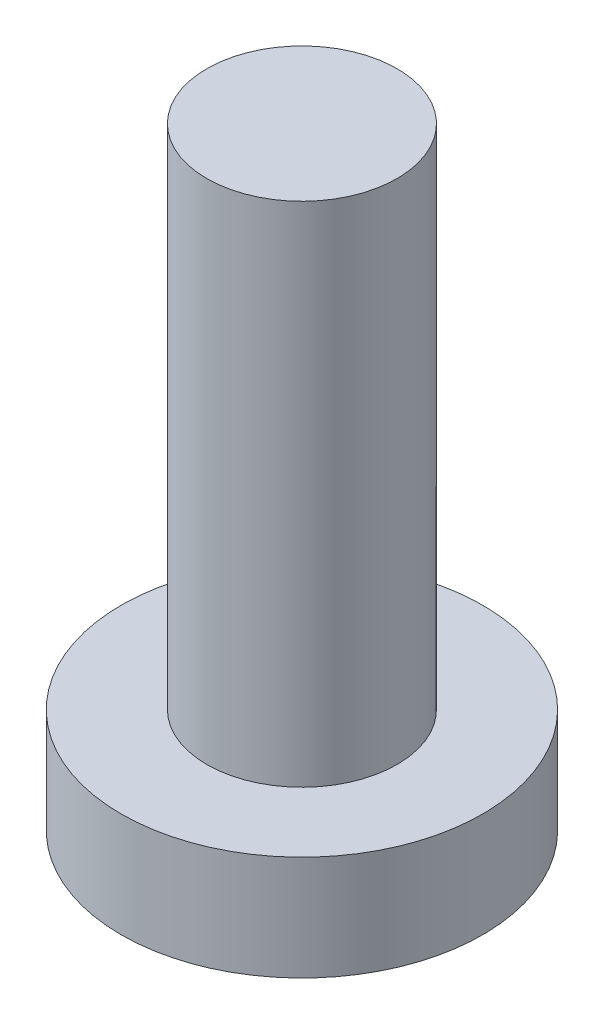
ISO-10303-21;
HEADER;
FILE_DESCRIPTION(('STEP AP214'),'2;1');
FILE_NAME('part.step','',(''),(''),'','','');
FILE_SCHEMA(('AUTOMOTIVE_DESIGN { 1 0 10303 214 1 1 1 1 }'));
ENDSEC;
DATA;
#1=APPLICATION_CONTEXT('core data for automotive mechanical design processes');
#2=APPLICATION_PROTOCOL_DEFINITION('international standard','automotive_design',2000,#1);
#3=PRODUCT_CONTEXT('',#1,'mechanical');
#4=PRODUCT('Part','Part','',(#3));
#5=PRODUCT_RELATED_PRODUCT_CATEGORY('part','',(#4));
#6=PRODUCT_DEFINITION_FORMATION('','',#4);
#7=PRODUCT_DEFINITION_CONTEXT('part definition',#1,'design');
#8=PRODUCT_DEFINITION('design','',#6,#7);
#9=PRODUCT_DEFINITION_SHAPE('','',#8);
#10=(LENGTH_UNIT() NAMED_UNIT(*) SI_UNIT(.MILLI.,.METRE.));
#11=(NAMED_UNIT(*) PLANE_ANGLE_UNIT() SI_UNIT($,.RADIAN.));
#12=(NAMED_UNIT(*) SI_UNIT($,.STERADIAN.) SOLID_ANGLE_UNIT());
#13=UNCERTAINTY_MEASURE_WITH_UNIT(LENGTH_MEASURE(1.E-05),#10,'distance_accuracy_value','');
#14=(GEOMETRIC_REPRESENTATION_CONTEXT(3) GLOBAL_UNCERTAINTY_ASSIGNED_CONTEXT((#13)) GLOBAL_UNIT_ASSIGNED_CONTEXT((#10,
#11,#12)) REPRESENTATION_CONTEXT('',''));
#15=CARTESIAN_POINT('',(0.,0.,0.));
#16=DIRECTION('',(0.,0.,1.));
#17=DIRECTION('',(1.,0.,0.));
#18=AXIS2_PLACEMENT_3D('',#15,#16,#17);
#19=CARTESIAN_POINT('',(0.,1.65,0.));
#20=DIRECTION('',(0.,-1.,0.));
#21=DIRECTION('',(0.,0.,-1.));
#22=AXIS2_PLACEMENT_3D('',#19,#20,#21);
#23=CYLINDRICAL_SURFACE('',#22,2.85);
#24=CARTESIAN_POINT('',(0.,1.65,0.));
#25=DIRECTION('',(0.,1.,0.));
#26=DIRECTION('',(0.,0.,1.));
#27=AXIS2_PLACEMENT_3D('',#24,#25,#26);
#28=CIRCLE('',#27,2.85);
#29=CARTESIAN_POINT('',(0.,1.65,2.85));
#30=VERTEX_POINT('',#29);
#31=EDGE_CURVE('E10',#30,#30,#28,.T.);
#32=ORIENTED_EDGE('',*,*,#31,.F.);
#33=EDGE_LOOP('',(#32));
#34=FACE_BOUND('',#33,.T.);
#35=CARTESIAN_POINT('',(0.,0.,0.));
#36=DIRECTION('',(0.,1.,0.));
#37=DIRECTION('',(0.,0.,1.));
#38=AXIS2_PLACEMENT_3D('',#35,#36,#37);
#39=CIRCLE('',#38,2.85);
#40=CARTESIAN_POINT('',(0.,0.,2.85));
#41=VERTEX_POINT('',#40);
#42=EDGE_CURVE('E34',#41,#41,#39,.T.);
#43=ORIENTED_EDGE('',*,*,#42,.T.);
#44=EDGE_LOOP('',(#43));
#45=FACE_BOUND('',#44,.T.);
#46=ADVANCED_FACE('F31',(#34,#45),#23,.T.);
#47=CARTESIAN_POINT('',(0.,1.65,0.));
#48=DIRECTION('',(0.,1.,0.));
#49=DIRECTION('',(0.,0.,1.));
#50=AXIS2_PLACEMENT_3D('',#47,#48,#49);
#51=PLANE('',#50);
#52=CARTESIAN_POINT('',(0.,1.65,0.));
#53=DIRECTION('',(0.,1.,0.));
#54=DIRECTION('',(0.,0.,1.));
#55=AXIS2_PLACEMENT_3D('',#52,#53,#54);
#56=CIRCLE('',#55,1.5);
#57=CARTESIAN_POINT('',(0.,1.65,1.5));
#58=VERTEX_POINT('',#57);
#59=EDGE_CURVE('E43',#58,#58,#56,.T.);
#60=ORIENTED_EDGE('',*,*,#59,.F.);
#61=EDGE_LOOP('',(#60));
#62=FACE_BOUND('',#61,.T.);
#63=ORIENTED_EDGE('',*,*,#31,.T.);
#64=EDGE_LOOP('',(#63));
#65=FACE_BOUND('',#64,.T.);
#66=ADVANCED_FACE('F58',(#62,#65),#51,.T.);
#67=CARTESIAN_POINT('',(0.,0.,0.));
#68=DIRECTION('',(0.,1.,0.));
#69=DIRECTION('',(0.,0.,1.));
#70=AXIS2_PLACEMENT_3D('',#67,#68,#69);
#71=PLANE('',#70);
#72=ORIENTED_EDGE('',*,*,#42,.F.);
#73=EDGE_LOOP('',(#72));
#74=FACE_BOUND('',#73,.T.);
#75=ADVANCED_FACE('F54',(#74),#71,.F.);
#76=CARTESIAN_POINT('',(0.,9.65,0.));
#77=DIRECTION('',(0.,-1.,0.));
#78=DIRECTION('',(0.,0.,-1.));
#79=AXIS2_PLACEMENT_3D('',#76,#77,#78);
#80=CYLINDRICAL_SURFACE('',#79,1.5);
#81=CARTESIAN_POINT('',(0.,9.65,0.));
#82=DIRECTION('',(0.,1.,0.));
#83=DIRECTION('',(0.,0.,1.));
#84=AXIS2_PLACEMENT_3D('',#81,#82,#83);
#85=CIRCLE('',#84,1.5);
#86=CARTESIAN_POINT('',(0.,9.65,1.5));
#87=VERTEX_POINT('',#86);
#88=EDGE_CURVE('E41',#87,#87,#85,.T.);
#89=ORIENTED_EDGE('',*,*,#88,.F.);
#90=EDGE_LOOP('',(#89));
#91=FACE_BOUND('',#90,.T.);
#92=ORIENTED_EDGE('',*,*,#59,.T.);
#93=EDGE_LOOP('',(#92));
#94=FACE_BOUND('',#93,.T.);
#95=ADVANCED_FACE('F51',(#91,#94),#80,.T.);
#96=CARTESIAN_POINT('',(0.,9.65,0.));
#97=DIRECTION('',(0.,1.,0.));
#98=DIRECTION('',(0.,0.,1.));
#99=AXIS2_PLACEMENT_3D('',#96,#97,#98);
#100=PLANE('',#99);
#101=ORIENTED_EDGE('',*,*,#88,.T.);
#102=EDGE_LOOP('',(#101));
#103=FACE_BOUND('',#102,.T.);
#104=ADVANCED_FACE('F49',(#103),#100,.T.);
#105=CLOSED_SHELL('',(#46,#66,#75,#95,#104));
#106=MANIFOLD_SOLID_BREP('B2',#105);
#107=ADVANCED_BREP_SHAPE_REPRESENTATION('',(#18,#106),#14);
#108=SHAPE_DEFINITION_REPRESENTATION(#9,#107);
ENDSEC;
END-ISO-10303-21;
